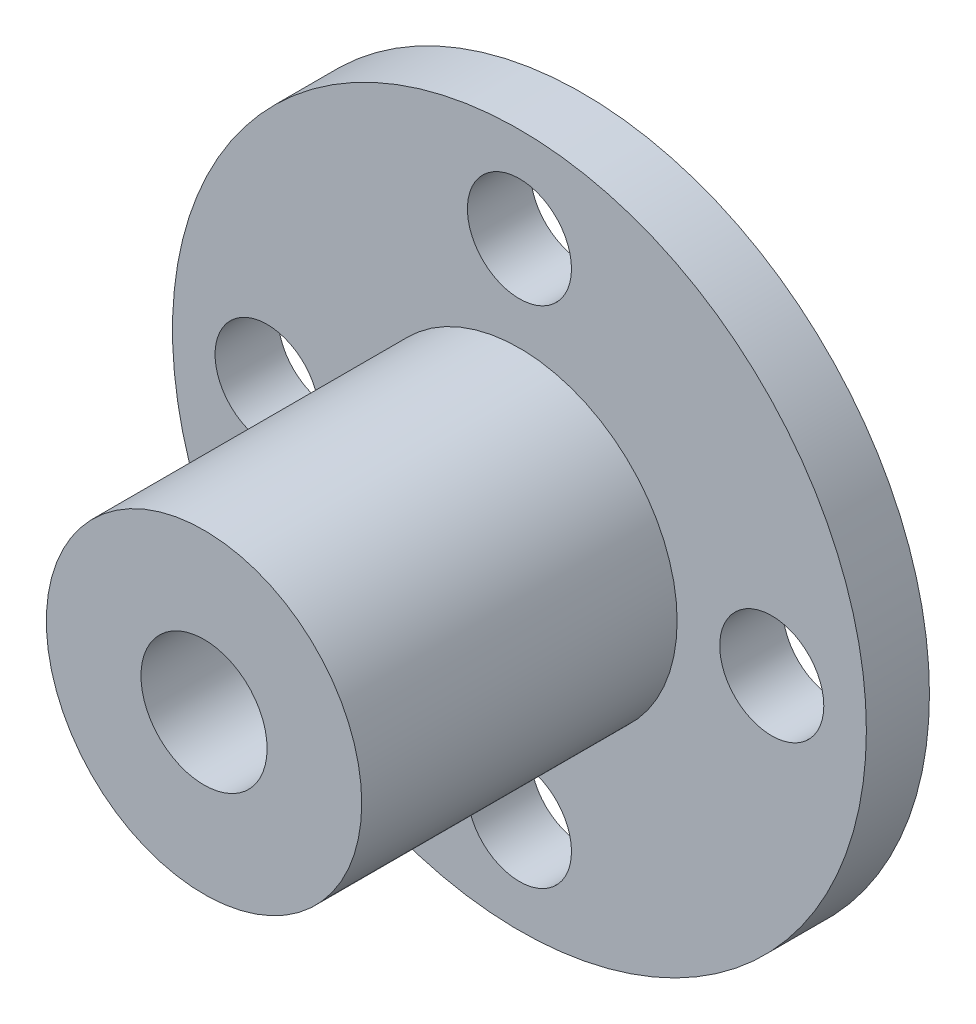
ISO-10303-21;
HEADER;
FILE_DESCRIPTION(('STEP AP214'),'2;1');
FILE_NAME('part.step','',(''),(''),'','','');
FILE_SCHEMA(('AUTOMOTIVE_DESIGN { 1 0 10303 214 1 1 1 1 }'));
ENDSEC;
DATA;
#1=APPLICATION_CONTEXT('core data for automotive mechanical design processes');
#2=APPLICATION_PROTOCOL_DEFINITION('international standard','automotive_design',2000,#1);
#3=PRODUCT_CONTEXT('',#1,'mechanical');
#4=PRODUCT('Part','Part','',(#3));
#5=PRODUCT_RELATED_PRODUCT_CATEGORY('part','',(#4));
#6=PRODUCT_DEFINITION_FORMATION('','',#4);
#7=PRODUCT_DEFINITION_CONTEXT('part definition',#1,'design');
#8=PRODUCT_DEFINITION('design','',#6,#7);
#9=PRODUCT_DEFINITION_SHAPE('','',#8);
#10=(LENGTH_UNIT() NAMED_UNIT(*) SI_UNIT(.MILLI.,.METRE.));
#11=(NAMED_UNIT(*) PLANE_ANGLE_UNIT() SI_UNIT($,.RADIAN.));
#12=(NAMED_UNIT(*) SI_UNIT($,.STERADIAN.) SOLID_ANGLE_UNIT());
#13=UNCERTAINTY_MEASURE_WITH_UNIT(LENGTH_MEASURE(1.E-05),#10,'distance_accuracy_value','');
#14=(GEOMETRIC_REPRESENTATION_CONTEXT(3) GLOBAL_UNCERTAINTY_ASSIGNED_CONTEXT((#13)) GLOBAL_UNIT_ASSIGNED_CONTEXT((#10,
#11,#12)) REPRESENTATION_CONTEXT('',''));
#15=CARTESIAN_POINT('',(0.,0.,0.));
#16=DIRECTION('',(0.,0.,1.));
#17=DIRECTION('',(1.,0.,0.));
#18=AXIS2_PLACEMENT_3D('',#15,#16,#17);
#19=CARTESIAN_POINT('',(0.,0.,2.));
#20=DIRECTION('',(0.,0.,1.));
#21=DIRECTION('',(1.,0.,0.));
#22=AXIS2_PLACEMENT_3D('',#19,#20,#21);
#23=PLANE('',#22);
#24=CARTESIAN_POINT('',(0.,0.,2.));
#25=DIRECTION('',(0.,0.,1.));
#26=DIRECTION('',(1.,0.,0.));
#27=AXIS2_PLACEMENT_3D('',#24,#25,#26);
#28=CIRCLE('',#27,11.);
#29=CARTESIAN_POINT('',(11.,0.,2.));
#30=VERTEX_POINT('',#29);
#31=EDGE_CURVE('E10',#30,#30,#28,.T.);
#32=ORIENTED_EDGE('',*,*,#31,.T.);
#33=EDGE_LOOP('',(#32));
#34=FACE_BOUND('',#33,.T.);
#35=CARTESIAN_POINT('',(8.,0.,2.));
#36=DIRECTION('',(0.,0.,1.));
#37=DIRECTION('',(1.,0.,0.));
#38=AXIS2_PLACEMENT_3D('',#35,#36,#37);
#39=CIRCLE('',#38,1.65);
#40=CARTESIAN_POINT('',(9.65,0.,2.));
#41=VERTEX_POINT('',#40);
#42=EDGE_CURVE('E43',#41,#41,#39,.T.);
#43=ORIENTED_EDGE('',*,*,#42,.F.);
#44=EDGE_LOOP('',(#43));
#45=FACE_BOUND('',#44,.T.);
#46=CARTESIAN_POINT('',(0.,8.,2.));
#47=DIRECTION('',(0.,0.,1.));
#48=DIRECTION('',(1.,0.,0.));
#49=AXIS2_PLACEMENT_3D('',#46,#47,#48);
#50=CIRCLE('',#49,1.65);
#51=CARTESIAN_POINT('',(1.65,8.,2.));
#52=VERTEX_POINT('',#51);
#53=EDGE_CURVE('E48',#52,#52,#50,.T.);
#54=ORIENTED_EDGE('',*,*,#53,.F.);
#55=EDGE_LOOP('',(#54));
#56=FACE_BOUND('',#55,.T.);
#57=CARTESIAN_POINT('',(-8.,0.,2.));
#58=DIRECTION('',(0.,0.,1.));
#59=DIRECTION('',(1.,0.,0.));
#60=AXIS2_PLACEMENT_3D('',#57,#58,#59);
#61=CIRCLE('',#60,1.65);
#62=CARTESIAN_POINT('',(-6.35,0.,2.));
#63=VERTEX_POINT('',#62);
#64=EDGE_CURVE('E73',#63,#63,#61,.T.);
#65=ORIENTED_EDGE('',*,*,#64,.F.);
#66=EDGE_LOOP('',(#65));
#67=FACE_BOUND('',#66,.T.);
#68=CARTESIAN_POINT('',(0.,-8.,2.));
#69=DIRECTION('',(0.,0.,1.));
#70=DIRECTION('',(1.,0.,0.));
#71=AXIS2_PLACEMENT_3D('',#68,#69,#70);
#72=CIRCLE('',#71,1.65);
#73=CARTESIAN_POINT('',(1.65,-8.,2.));
#74=VERTEX_POINT('',#73);
#75=EDGE_CURVE('E69',#74,#74,#72,.T.);
#76=ORIENTED_EDGE('',*,*,#75,.F.);
#77=EDGE_LOOP('',(#76));
#78=FACE_BOUND('',#77,.T.);
#79=CARTESIAN_POINT('',(0.,0.,2.));
#80=DIRECTION('',(0.,0.,1.));
#81=DIRECTION('',(1.,0.,0.));
#82=AXIS2_PLACEMENT_3D('',#79,#80,#81);
#83=CIRCLE('',#82,5.);
#84=CARTESIAN_POINT('',(5.,0.,2.));
#85=VERTEX_POINT('',#84);
#86=EDGE_CURVE('E80',#85,#85,#83,.T.);
#87=ORIENTED_EDGE('',*,*,#86,.F.);
#88=EDGE_LOOP('',(#87));
#89=FACE_BOUND('',#88,.T.);
#90=ADVANCED_FACE('F35',(#34,#45,#56,#67,#78,#89),#23,.T.);
#91=CARTESIAN_POINT('',(0.,0.,2.));
#92=DIRECTION('',(0.,0.,-1.));
#93=DIRECTION('',(-1.,0.,0.));
#94=AXIS2_PLACEMENT_3D('',#91,#92,#93);
#95=CYLINDRICAL_SURFACE('',#94,11.);
#96=ORIENTED_EDGE('',*,*,#31,.F.);
#97=EDGE_LOOP('',(#96));
#98=FACE_BOUND('',#97,.T.);
#99=CARTESIAN_POINT('',(0.,0.,0.));
#100=DIRECTION('',(0.,0.,1.));
#101=DIRECTION('',(1.,0.,0.));
#102=AXIS2_PLACEMENT_3D('',#99,#100,#101);
#103=CIRCLE('',#102,11.);
#104=CARTESIAN_POINT('',(11.,0.,0.));
#105=VERTEX_POINT('',#104);
#106=EDGE_CURVE('E64',#105,#105,#103,.T.);
#107=ORIENTED_EDGE('',*,*,#106,.T.);
#108=EDGE_LOOP('',(#107));
#109=FACE_BOUND('',#108,.T.);
#110=ADVANCED_FACE('F90',(#98,#109),#95,.T.);
#111=CARTESIAN_POINT('',(8.,0.,2.));
#112=DIRECTION('',(0.,0.,-1.));
#113=DIRECTION('',(-1.,0.,0.));
#114=AXIS2_PLACEMENT_3D('',#111,#112,#113);
#115=CYLINDRICAL_SURFACE('',#114,1.65);
#116=ORIENTED_EDGE('',*,*,#42,.T.);
#117=EDGE_LOOP('',(#116));
#118=FACE_BOUND('',#117,.T.);
#119=CARTESIAN_POINT('',(8.,0.,0.));
#120=DIRECTION('',(0.,0.,1.));
#121=DIRECTION('',(1.,0.,0.));
#122=AXIS2_PLACEMENT_3D('',#119,#120,#121);
#123=CIRCLE('',#122,1.65);
#124=CARTESIAN_POINT('',(9.65,0.,0.));
#125=VERTEX_POINT('',#124);
#126=EDGE_CURVE('E62',#125,#125,#123,.T.);
#127=ORIENTED_EDGE('',*,*,#126,.F.);
#128=EDGE_LOOP('',(#127));
#129=FACE_BOUND('',#128,.T.);
#130=ADVANCED_FACE('F126',(#118,#129),#115,.F.);
#131=CARTESIAN_POINT('',(0.,8.,2.));
#132=DIRECTION('',(0.,0.,-1.));
#133=DIRECTION('',(-1.,0.,0.));
#134=AXIS2_PLACEMENT_3D('',#131,#132,#133);
#135=CYLINDRICAL_SURFACE('',#134,1.65);
#136=ORIENTED_EDGE('',*,*,#53,.T.);
#137=EDGE_LOOP('',(#136));
#138=FACE_BOUND('',#137,.T.);
#139=CARTESIAN_POINT('',(0.,8.,0.));
#140=DIRECTION('',(0.,0.,1.));
#141=DIRECTION('',(1.,0.,0.));
#142=AXIS2_PLACEMENT_3D('',#139,#140,#141);
#143=CIRCLE('',#142,1.65);
#144=CARTESIAN_POINT('',(1.65,8.,0.));
#145=VERTEX_POINT('',#144);
#146=EDGE_CURVE('E59',#145,#145,#143,.T.);
#147=ORIENTED_EDGE('',*,*,#146,.F.);
#148=EDGE_LOOP('',(#147));
#149=FACE_BOUND('',#148,.T.);
#150=ADVANCED_FACE('F85',(#138,#149),#135,.F.);
#151=CARTESIAN_POINT('',(-8.,0.,2.));
#152=DIRECTION('',(0.,0.,-1.));
#153=DIRECTION('',(-1.,0.,0.));
#154=AXIS2_PLACEMENT_3D('',#151,#152,#153);
#155=CYLINDRICAL_SURFACE('',#154,1.65);
#156=ORIENTED_EDGE('',*,*,#64,.T.);
#157=EDGE_LOOP('',(#156));
#158=FACE_BOUND('',#157,.T.);
#159=CARTESIAN_POINT('',(-8.,0.,0.));
#160=DIRECTION('',(0.,0.,1.));
#161=DIRECTION('',(1.,0.,0.));
#162=AXIS2_PLACEMENT_3D('',#159,#160,#161);
#163=CIRCLE('',#162,1.65);
#164=CARTESIAN_POINT('',(-6.35,0.,0.));
#165=VERTEX_POINT('',#164);
#166=EDGE_CURVE('E55',#165,#165,#163,.T.);
#167=ORIENTED_EDGE('',*,*,#166,.F.);
#168=EDGE_LOOP('',(#167));
#169=FACE_BOUND('',#168,.T.);
#170=ADVANCED_FACE('F132',(#158,#169),#155,.F.);
#171=CARTESIAN_POINT('',(0.,-8.,2.));
#172=DIRECTION('',(0.,0.,-1.));
#173=DIRECTION('',(-1.,0.,0.));
#174=AXIS2_PLACEMENT_3D('',#171,#172,#173);
#175=CYLINDRICAL_SURFACE('',#174,1.65);
#176=ORIENTED_EDGE('',*,*,#75,.T.);
#177=EDGE_LOOP('',(#176));
#178=FACE_BOUND('',#177,.T.);
#179=CARTESIAN_POINT('',(0.,-8.,0.));
#180=DIRECTION('',(0.,0.,1.));
#181=DIRECTION('',(1.,0.,0.));
#182=AXIS2_PLACEMENT_3D('',#179,#180,#181);
#183=CIRCLE('',#182,1.65);
#184=CARTESIAN_POINT('',(1.65,-8.,0.));
#185=VERTEX_POINT('',#184);
#186=EDGE_CURVE('E52',#185,#185,#183,.T.);
#187=ORIENTED_EDGE('',*,*,#186,.F.);
#188=EDGE_LOOP('',(#187));
#189=FACE_BOUND('',#188,.T.);
#190=ADVANCED_FACE('F37',(#178,#189),#175,.F.);
#191=CARTESIAN_POINT('',(0.,0.,2.));
#192=DIRECTION('',(0.,0.,-1.));
#193=DIRECTION('',(-1.,0.,0.));
#194=AXIS2_PLACEMENT_3D('',#191,#192,#193);
#195=CYLINDRICAL_SURFACE('',#194,2.);
#196=CARTESIAN_POINT('',(0.,0.,0.));
#197=DIRECTION('',(0.,0.,1.));
#198=DIRECTION('',(1.,0.,0.));
#199=AXIS2_PLACEMENT_3D('',#196,#197,#198);
#200=CIRCLE('',#199,2.);
#201=CARTESIAN_POINT('',(2.,0.,0.));
#202=VERTEX_POINT('',#201);
#203=EDGE_CURVE('E39',#202,#202,#200,.T.);
#204=ORIENTED_EDGE('',*,*,#203,.F.);
#205=EDGE_LOOP('',(#204));
#206=FACE_BOUND('',#205,.T.);
#207=CARTESIAN_POINT('',(0.,0.,12.));
#208=DIRECTION('',(0.,0.,1.));
#209=DIRECTION('',(1.,0.,0.));
#210=AXIS2_PLACEMENT_3D('',#207,#208,#209);
#211=CIRCLE('',#210,2.);
#212=CARTESIAN_POINT('',(2.,0.,12.));
#213=VERTEX_POINT('',#212);
#214=EDGE_CURVE('E98',#213,#213,#211,.T.);
#215=ORIENTED_EDGE('',*,*,#214,.T.);
#216=EDGE_LOOP('',(#215));
#217=FACE_BOUND('',#216,.T.);
#218=ADVANCED_FACE('F104',(#206,#217),#195,.F.);
#219=CARTESIAN_POINT('',(0.,0.,0.));
#220=DIRECTION('',(0.,0.,1.));
#221=DIRECTION('',(1.,0.,0.));
#222=AXIS2_PLACEMENT_3D('',#219,#220,#221);
#223=PLANE('',#222);
#224=ORIENTED_EDGE('',*,*,#186,.T.);
#225=EDGE_LOOP('',(#224));
#226=FACE_BOUND('',#225,.T.);
#227=ORIENTED_EDGE('',*,*,#166,.T.);
#228=EDGE_LOOP('',(#227));
#229=FACE_BOUND('',#228,.T.);
#230=ORIENTED_EDGE('',*,*,#146,.T.);
#231=EDGE_LOOP('',(#230));
#232=FACE_BOUND('',#231,.T.);
#233=ORIENTED_EDGE('',*,*,#126,.T.);
#234=EDGE_LOOP('',(#233));
#235=FACE_BOUND('',#234,.T.);
#236=ORIENTED_EDGE('',*,*,#106,.F.);
#237=EDGE_LOOP('',(#236));
#238=FACE_BOUND('',#237,.T.);
#239=ORIENTED_EDGE('',*,*,#203,.T.);
#240=EDGE_LOOP('',(#239));
#241=FACE_BOUND('',#240,.T.);
#242=ADVANCED_FACE('F109',(#226,#229,#232,#235,#238,#241),#223,.F.);
#243=CARTESIAN_POINT('',(0.,0.,12.));
#244=DIRECTION('',(0.,0.,1.));
#245=DIRECTION('',(1.,0.,0.));
#246=AXIS2_PLACEMENT_3D('',#243,#244,#245);
#247=PLANE('',#246);
#248=CARTESIAN_POINT('',(0.,0.,12.));
#249=DIRECTION('',(0.,0.,1.));
#250=DIRECTION('',(1.,0.,0.));
#251=AXIS2_PLACEMENT_3D('',#248,#249,#250);
#252=CIRCLE('',#251,5.);
#253=CARTESIAN_POINT('',(5.,0.,12.));
#254=VERTEX_POINT('',#253);
#255=EDGE_CURVE('E56',#254,#254,#252,.T.);
#256=ORIENTED_EDGE('',*,*,#255,.T.);
#257=EDGE_LOOP('',(#256));
#258=FACE_BOUND('',#257,.T.);
#259=ORIENTED_EDGE('',*,*,#214,.F.);
#260=EDGE_LOOP('',(#259));
#261=FACE_BOUND('',#260,.T.);
#262=ADVANCED_FACE('F106',(#258,#261),#247,.T.);
#263=CARTESIAN_POINT('',(0.,0.,12.));
#264=DIRECTION('',(0.,0.,-1.));
#265=DIRECTION('',(-1.,0.,0.));
#266=AXIS2_PLACEMENT_3D('',#263,#264,#265);
#267=CYLINDRICAL_SURFACE('',#266,5.);
#268=ORIENTED_EDGE('',*,*,#255,.F.);
#269=EDGE_LOOP('',(#268));
#270=FACE_BOUND('',#269,.T.);
#271=ORIENTED_EDGE('',*,*,#86,.T.);
#272=EDGE_LOOP('',(#271));
#273=FACE_BOUND('',#272,.T.);
#274=ADVANCED_FACE('F108',(#270,#273),#267,.T.);
#275=CLOSED_SHELL('',(#90,#110,#130,#150,#170,#190,#218,#242,#262,#274));
#276=MANIFOLD_SOLID_BREP('B2',#275);
#277=ADVANCED_BREP_SHAPE_REPRESENTATION('',(#18,#276),#14);
#278=SHAPE_DEFINITION_REPRESENTATION(#9,#277);
ENDSEC;
END-ISO-10303-21;
